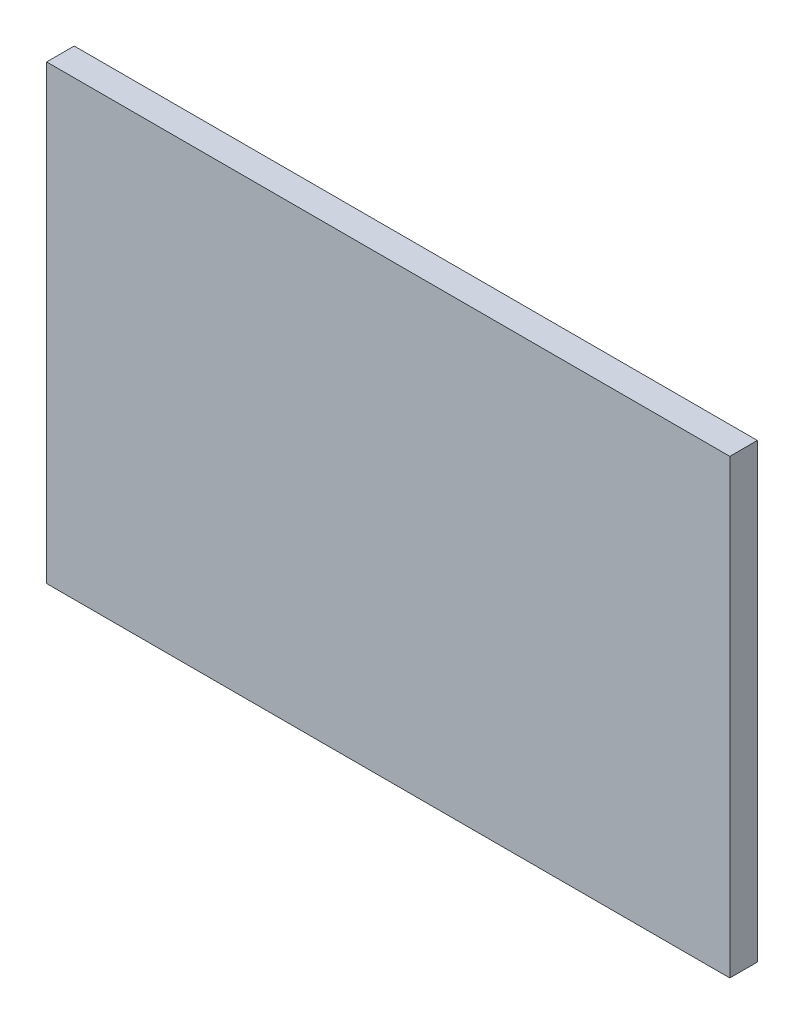
ISO-10303-21;
HEADER;
FILE_DESCRIPTION(('STEP AP214'),'2;1');
FILE_NAME('part.step','',(''),(''),'','','');
FILE_SCHEMA(('AUTOMOTIVE_DESIGN { 1 0 10303 214 1 1 1 1 }'));
ENDSEC;
DATA;
#1=APPLICATION_CONTEXT('core data for automotive mechanical design processes');
#2=APPLICATION_PROTOCOL_DEFINITION('international standard','automotive_design',2000,#1);
#3=PRODUCT_CONTEXT('',#1,'mechanical');
#4=PRODUCT('Part','Part','',(#3));
#5=PRODUCT_RELATED_PRODUCT_CATEGORY('part','',(#4));
#6=PRODUCT_DEFINITION_FORMATION('','',#4);
#7=PRODUCT_DEFINITION_CONTEXT('part definition',#1,'design');
#8=PRODUCT_DEFINITION('design','',#6,#7);
#9=PRODUCT_DEFINITION_SHAPE('','',#8);
#10=(LENGTH_UNIT() NAMED_UNIT(*) SI_UNIT(.MILLI.,.METRE.));
#11=(NAMED_UNIT(*) PLANE_ANGLE_UNIT() SI_UNIT($,.RADIAN.));
#12=(NAMED_UNIT(*) SI_UNIT($,.STERADIAN.) SOLID_ANGLE_UNIT());
#13=UNCERTAINTY_MEASURE_WITH_UNIT(LENGTH_MEASURE(1.E-05),#10,'distance_accuracy_value','');
#14=(GEOMETRIC_REPRESENTATION_CONTEXT(3) GLOBAL_UNCERTAINTY_ASSIGNED_CONTEXT((#13)) GLOBAL_UNIT_ASSIGNED_CONTEXT((#10,
#11,#12)) REPRESENTATION_CONTEXT('',''));
#15=CARTESIAN_POINT('',(0.,0.,0.));
#16=DIRECTION('',(0.,0.,1.));
#17=DIRECTION('',(1.,0.,0.));
#18=AXIS2_PLACEMENT_3D('',#15,#16,#17);
#19=CARTESIAN_POINT('',(-62.,41.,5.));
#20=DIRECTION('',(1.,0.,0.));
#21=DIRECTION('',(0.,1.,0.));
#22=AXIS2_PLACEMENT_3D('',#19,#20,#21);
#23=PLANE('',#22);
#24=DIRECTION('',(0.,-1.,0.));
#25=VECTOR('',#24,1.);
#26=CARTESIAN_POINT('',(-62.,41.,0.));
#27=LINE('',#26,#25);
#28=CARTESIAN_POINT('',(-62.,41.,0.));
#29=VERTEX_POINT('',#28);
#30=CARTESIAN_POINT('',(-62.,-41.,0.));
#31=VERTEX_POINT('',#30);
#32=EDGE_CURVE('E96',#29,#31,#27,.T.);
#33=ORIENTED_EDGE('',*,*,#32,.T.);
#34=DIRECTION('',(0.,0.,-1.));
#35=VECTOR('',#34,1.);
#36=CARTESIAN_POINT('',(-62.,-41.,5.));
#37=LINE('',#36,#35);
#38=CARTESIAN_POINT('',(-62.,-41.,5.));
#39=VERTEX_POINT('',#38);
#40=EDGE_CURVE('E11',#39,#31,#37,.T.);
#41=ORIENTED_EDGE('',*,*,#40,.F.);
#42=DIRECTION('',(0.,-1.,0.));
#43=VECTOR('',#42,1.);
#44=CARTESIAN_POINT('',(-62.,41.,5.));
#45=LINE('',#44,#43);
#46=CARTESIAN_POINT('',(-62.,41.,5.));
#47=VERTEX_POINT('',#46);
#48=EDGE_CURVE('E84',#47,#39,#45,.T.);
#49=ORIENTED_EDGE('',*,*,#48,.F.);
#50=DIRECTION('',(0.,0.,-1.));
#51=VECTOR('',#50,1.);
#52=CARTESIAN_POINT('',(-62.,41.,5.));
#53=LINE('',#52,#51);
#54=EDGE_CURVE('E92',#47,#29,#53,.T.);
#55=ORIENTED_EDGE('',*,*,#54,.T.);
#56=EDGE_LOOP('',(#33,#41,#49,#55));
#57=FACE_BOUND('',#56,.T.);
#58=ADVANCED_FACE('F33',(#57),#23,.F.);
#59=CARTESIAN_POINT('',(-62.,-41.,5.));
#60=DIRECTION('',(0.,1.,0.));
#61=DIRECTION('',(0.,0.,1.));
#62=AXIS2_PLACEMENT_3D('',#59,#60,#61);
#63=PLANE('',#62);
#64=DIRECTION('',(1.,0.,0.));
#65=VECTOR('',#64,1.);
#66=CARTESIAN_POINT('',(-62.,-41.,0.));
#67=LINE('',#66,#65);
#68=CARTESIAN_POINT('',(62.,-41.,0.));
#69=VERTEX_POINT('',#68);
#70=EDGE_CURVE('E88',#31,#69,#67,.T.);
#71=ORIENTED_EDGE('',*,*,#70,.T.);
#72=DIRECTION('',(0.,0.,-1.));
#73=VECTOR('',#72,1.);
#74=CARTESIAN_POINT('',(62.,-41.,5.));
#75=LINE('',#74,#73);
#76=CARTESIAN_POINT('',(62.,-41.,5.));
#77=VERTEX_POINT('',#76);
#78=EDGE_CURVE('E41',#77,#69,#75,.T.);
#79=ORIENTED_EDGE('',*,*,#78,.F.);
#80=DIRECTION('',(1.,0.,0.));
#81=VECTOR('',#80,1.);
#82=CARTESIAN_POINT('',(-62.,-41.,5.));
#83=LINE('',#82,#81);
#84=EDGE_CURVE('E79',#39,#77,#83,.T.);
#85=ORIENTED_EDGE('',*,*,#84,.F.);
#86=ORIENTED_EDGE('',*,*,#40,.T.);
#87=EDGE_LOOP('',(#71,#79,#85,#86));
#88=FACE_BOUND('',#87,.T.);
#89=ADVANCED_FACE('F87',(#88),#63,.F.);
#90=CARTESIAN_POINT('',(62.,41.,5.));
#91=DIRECTION('',(-1.,0.,0.));
#92=DIRECTION('',(0.,-1.,0.));
#93=AXIS2_PLACEMENT_3D('',#90,#91,#92);
#94=PLANE('',#93);
#95=DIRECTION('',(0.,1.,0.));
#96=VECTOR('',#95,1.);
#97=CARTESIAN_POINT('',(62.,41.,0.));
#98=LINE('',#97,#96);
#99=CARTESIAN_POINT('',(62.,41.,0.));
#100=VERTEX_POINT('',#99);
#101=EDGE_CURVE('E66',#69,#100,#98,.T.);
#102=ORIENTED_EDGE('',*,*,#101,.T.);
#103=DIRECTION('',(0.,0.,-1.));
#104=VECTOR('',#103,1.);
#105=CARTESIAN_POINT('',(62.,41.,5.));
#106=LINE('',#105,#104);
#107=CARTESIAN_POINT('',(62.,41.,5.));
#108=VERTEX_POINT('',#107);
#109=EDGE_CURVE('E89',#108,#100,#106,.T.);
#110=ORIENTED_EDGE('',*,*,#109,.F.);
#111=DIRECTION('',(0.,1.,0.));
#112=VECTOR('',#111,1.);
#113=CARTESIAN_POINT('',(62.,41.,5.));
#114=LINE('',#113,#112);
#115=EDGE_CURVE('E82',#77,#108,#114,.T.);
#116=ORIENTED_EDGE('',*,*,#115,.F.);
#117=ORIENTED_EDGE('',*,*,#78,.T.);
#118=EDGE_LOOP('',(#102,#110,#116,#117));
#119=FACE_BOUND('',#118,.T.);
#120=ADVANCED_FACE('F90',(#119),#94,.F.);
#121=CARTESIAN_POINT('',(-62.,41.,5.));
#122=DIRECTION('',(0.,-1.,0.));
#123=DIRECTION('',(0.,0.,-1.));
#124=AXIS2_PLACEMENT_3D('',#121,#122,#123);
#125=PLANE('',#124);
#126=DIRECTION('',(-1.,0.,0.));
#127=VECTOR('',#126,1.);
#128=CARTESIAN_POINT('',(-62.,41.,0.));
#129=LINE('',#128,#127);
#130=EDGE_CURVE('E72',#100,#29,#129,.T.);
#131=ORIENTED_EDGE('',*,*,#130,.T.);
#132=ORIENTED_EDGE('',*,*,#54,.F.);
#133=DIRECTION('',(-1.,0.,0.));
#134=VECTOR('',#133,1.);
#135=CARTESIAN_POINT('',(-62.,41.,5.));
#136=LINE('',#135,#134);
#137=EDGE_CURVE('E49',#108,#47,#136,.T.);
#138=ORIENTED_EDGE('',*,*,#137,.F.);
#139=ORIENTED_EDGE('',*,*,#109,.T.);
#140=EDGE_LOOP('',(#131,#132,#138,#139));
#141=FACE_BOUND('',#140,.T.);
#142=ADVANCED_FACE('F103',(#141),#125,.F.);
#143=CARTESIAN_POINT('',(0.,0.,5.));
#144=DIRECTION('',(0.,0.,1.));
#145=DIRECTION('',(1.,0.,0.));
#146=AXIS2_PLACEMENT_3D('',#143,#144,#145);
#147=PLANE('',#146);
#148=ORIENTED_EDGE('',*,*,#48,.T.);
#149=ORIENTED_EDGE('',*,*,#84,.T.);
#150=ORIENTED_EDGE('',*,*,#115,.T.);
#151=ORIENTED_EDGE('',*,*,#137,.T.);
#152=EDGE_LOOP('',(#148,#149,#150,#151));
#153=FACE_BOUND('',#152,.T.);
#154=ADVANCED_FACE('F80',(#153),#147,.T.);
#155=CARTESIAN_POINT('',(0.,0.,0.));
#156=DIRECTION('',(0.,0.,1.));
#157=DIRECTION('',(1.,0.,0.));
#158=AXIS2_PLACEMENT_3D('',#155,#156,#157);
#159=PLANE('',#158);
#160=ORIENTED_EDGE('',*,*,#32,.F.);
#161=ORIENTED_EDGE('',*,*,#130,.F.);
#162=ORIENTED_EDGE('',*,*,#101,.F.);
#163=ORIENTED_EDGE('',*,*,#70,.F.);
#164=EDGE_LOOP('',(#160,#161,#162,#163));
#165=FACE_BOUND('',#164,.T.);
#166=ADVANCED_FACE('F106',(#165),#159,.F.);
#167=CLOSED_SHELL('',(#58,#89,#120,#142,#154,#166));
#168=MANIFOLD_SOLID_BREP('B2',#167);
#169=ADVANCED_BREP_SHAPE_REPRESENTATION('',(#18,#168),#14);
#170=SHAPE_DEFINITION_REPRESENTATION(#9,#169);
ENDSEC;
END-ISO-10303-21;
